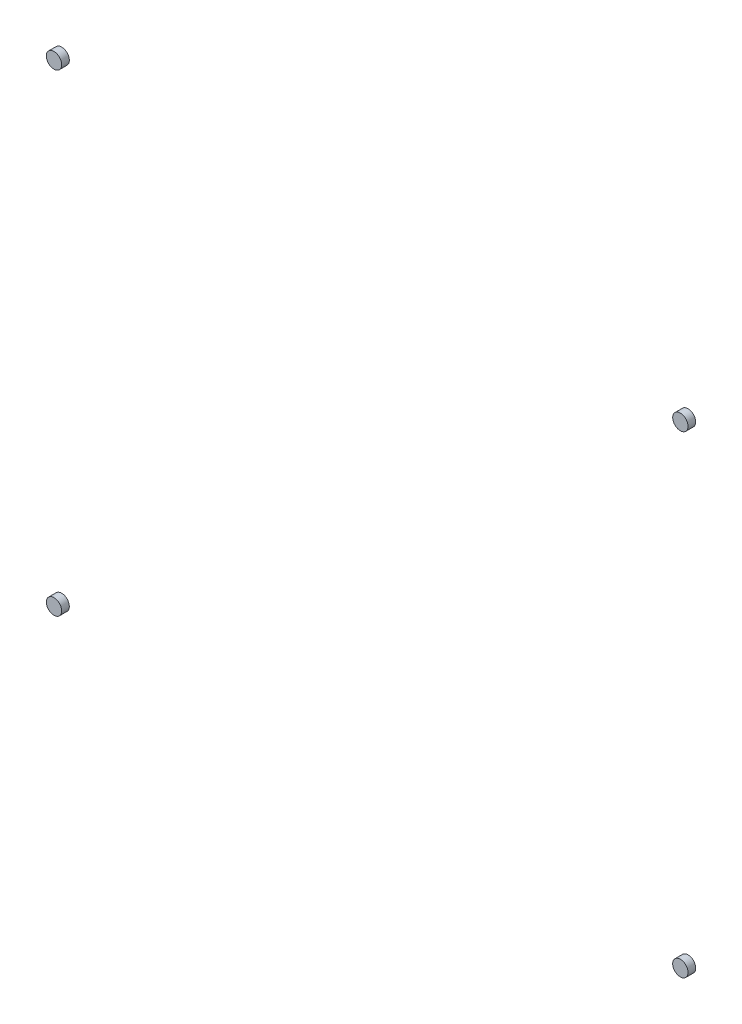
ISO-10303-21;
HEADER;
FILE_DESCRIPTION(('STEP AP214'),'2;1');
FILE_NAME('part.step','',(''),(''),'','','');
FILE_SCHEMA(('AUTOMOTIVE_DESIGN { 1 0 10303 214 1 1 1 1 }'));
ENDSEC;
DATA;
#1=APPLICATION_CONTEXT('core data for automotive mechanical design processes');
#2=APPLICATION_PROTOCOL_DEFINITION('international standard','automotive_design',2000,#1);
#3=PRODUCT_CONTEXT('',#1,'mechanical');
#4=PRODUCT('Part','Part','',(#3));
#5=PRODUCT_RELATED_PRODUCT_CATEGORY('part','',(#4));
#6=PRODUCT_DEFINITION_FORMATION('','',#4);
#7=PRODUCT_DEFINITION_CONTEXT('part definition',#1,'design');
#8=PRODUCT_DEFINITION('design','',#6,#7);
#9=PRODUCT_DEFINITION_SHAPE('','',#8);
#10=(LENGTH_UNIT() NAMED_UNIT(*) SI_UNIT(.MILLI.,.METRE.));
#11=(NAMED_UNIT(*) PLANE_ANGLE_UNIT() SI_UNIT($,.RADIAN.));
#12=(NAMED_UNIT(*) SI_UNIT($,.STERADIAN.) SOLID_ANGLE_UNIT());
#13=UNCERTAINTY_MEASURE_WITH_UNIT(LENGTH_MEASURE(1.E-05),#10,'distance_accuracy_value','');
#14=(GEOMETRIC_REPRESENTATION_CONTEXT(3) GLOBAL_UNCERTAINTY_ASSIGNED_CONTEXT((#13)) GLOBAL_UNIT_ASSIGNED_CONTEXT((#10,
#11,#12)) REPRESENTATION_CONTEXT('',''));
#15=CARTESIAN_POINT('',(0.,0.,0.));
#16=DIRECTION('',(0.,0.,1.));
#17=DIRECTION('',(1.,0.,0.));
#18=AXIS2_PLACEMENT_3D('',#15,#16,#17);
#19=CARTESIAN_POINT('',(-245.,-185.,6.));
#20=DIRECTION('',(0.,0.,1.));
#21=DIRECTION('',(1.,0.,0.));
#22=AXIS2_PLACEMENT_3D('',#19,#20,#21);
#23=PLANE('',#22);
#24=CARTESIAN_POINT('',(-245.,-185.,6.));
#25=DIRECTION('',(0.,0.,-1.));
#26=DIRECTION('',(-1.,0.,0.));
#27=AXIS2_PLACEMENT_3D('',#24,#25,#26);
#28=CIRCLE('',#27,6.);
#29=CARTESIAN_POINT('',(-251.,-185.,6.));
#30=VERTEX_POINT('',#29);
#31=EDGE_CURVE('P0_E10',#30,#30,#28,.T.);
#32=ORIENTED_EDGE('',*,*,#31,.F.);
#33=EDGE_LOOP('',(#32));
#34=FACE_BOUND('',#33,.T.);
#35=ADVANCED_FACE('P0_F15',(#34),#23,.T.);
#36=CARTESIAN_POINT('',(-245.,-185.,0.));
#37=DIRECTION('',(0.,0.,-1.));
#38=DIRECTION('',(-1.,0.,0.));
#39=AXIS2_PLACEMENT_3D('',#36,#37,#38);
#40=PLANE('',#39);
#41=CARTESIAN_POINT('',(-245.,-185.,0.));
#42=DIRECTION('',(0.,0.,1.));
#43=DIRECTION('',(1.,0.,0.));
#44=AXIS2_PLACEMENT_3D('',#41,#42,#43);
#45=CIRCLE('',#44,6.);
#46=CARTESIAN_POINT('',(-239.,-185.,0.));
#47=VERTEX_POINT('',#46);
#48=EDGE_CURVE('P0_E23',#47,#47,#45,.T.);
#49=ORIENTED_EDGE('',*,*,#48,.F.);
#50=EDGE_LOOP('',(#49));
#51=FACE_BOUND('',#50,.T.);
#52=ADVANCED_FACE('P0_F32',(#51),#40,.T.);
#53=CARTESIAN_POINT('',(-245.,-185.,0.));
#54=DIRECTION('',(0.,0.,1.));
#55=DIRECTION('',(1.,0.,0.));
#56=AXIS2_PLACEMENT_3D('',#53,#54,#55);
#57=CYLINDRICAL_SURFACE('',#56,6.);
#58=ORIENTED_EDGE('',*,*,#31,.T.);
#59=EDGE_LOOP('',(#58));
#60=FACE_BOUND('',#59,.T.);
#61=ORIENTED_EDGE('',*,*,#48,.T.);
#62=EDGE_LOOP('',(#61));
#63=FACE_BOUND('',#62,.T.);
#64=ADVANCED_FACE('P0_F17',(#60,#63),#57,.T.);
#65=CLOSED_SHELL('',(#35,#52,#64));
#66=MANIFOLD_SOLID_BREP('P0_B1',#65);
#67=CARTESIAN_POINT('',(-245.,185.,6.));
#68=DIRECTION('',(0.,0.,1.));
#69=DIRECTION('',(1.,0.,0.));
#70=AXIS2_PLACEMENT_3D('',#67,#68,#69);
#71=PLANE('',#70);
#72=CARTESIAN_POINT('',(-245.,185.,6.));
#73=DIRECTION('',(0.,0.,-1.));
#74=DIRECTION('',(-1.,0.,0.));
#75=AXIS2_PLACEMENT_3D('',#72,#73,#74);
#76=CIRCLE('',#75,6.);
#77=CARTESIAN_POINT('',(-251.,185.,6.));
#78=VERTEX_POINT('',#77);
#79=EDGE_CURVE('P1_E10',#78,#78,#76,.T.);
#80=ORIENTED_EDGE('',*,*,#79,.F.);
#81=EDGE_LOOP('',(#80));
#82=FACE_BOUND('',#81,.T.);
#83=ADVANCED_FACE('P1_F15',(#82),#71,.T.);
#84=CARTESIAN_POINT('',(-245.,185.,0.));
#85=DIRECTION('',(0.,0.,-1.));
#86=DIRECTION('',(-1.,0.,0.));
#87=AXIS2_PLACEMENT_3D('',#84,#85,#86);
#88=PLANE('',#87);
#89=CARTESIAN_POINT('',(-245.,185.,0.));
#90=DIRECTION('',(0.,0.,1.));
#91=DIRECTION('',(1.,0.,0.));
#92=AXIS2_PLACEMENT_3D('',#89,#90,#91);
#93=CIRCLE('',#92,6.);
#94=CARTESIAN_POINT('',(-239.,185.,0.));
#95=VERTEX_POINT('',#94);
#96=EDGE_CURVE('P1_E23',#95,#95,#93,.T.);
#97=ORIENTED_EDGE('',*,*,#96,.F.);
#98=EDGE_LOOP('',(#97));
#99=FACE_BOUND('',#98,.T.);
#100=ADVANCED_FACE('P1_F32',(#99),#88,.T.);
#101=CARTESIAN_POINT('',(-245.,185.,0.));
#102=DIRECTION('',(0.,0.,1.));
#103=DIRECTION('',(1.,0.,0.));
#104=AXIS2_PLACEMENT_3D('',#101,#102,#103);
#105=CYLINDRICAL_SURFACE('',#104,6.);
#106=ORIENTED_EDGE('',*,*,#79,.T.);
#107=EDGE_LOOP('',(#106));
#108=FACE_BOUND('',#107,.T.);
#109=ORIENTED_EDGE('',*,*,#96,.T.);
#110=EDGE_LOOP('',(#109));
#111=FACE_BOUND('',#110,.T.);
#112=ADVANCED_FACE('P1_F17',(#108,#111),#105,.T.);
#113=CLOSED_SHELL('',(#83,#100,#112));
#114=MANIFOLD_SOLID_BREP('P1_B1',#113);
#115=CARTESIAN_POINT('',(245.,-185.,6.));
#116=DIRECTION('',(0.,0.,1.));
#117=DIRECTION('',(1.,0.,0.));
#118=AXIS2_PLACEMENT_3D('',#115,#116,#117);
#119=PLANE('',#118);
#120=CARTESIAN_POINT('',(245.,-185.,6.));
#121=DIRECTION('',(0.,0.,-1.));
#122=DIRECTION('',(-1.,0.,0.));
#123=AXIS2_PLACEMENT_3D('',#120,#121,#122);
#124=CIRCLE('',#123,6.);
#125=CARTESIAN_POINT('',(239.,-185.,6.));
#126=VERTEX_POINT('',#125);
#127=EDGE_CURVE('P2_E10',#126,#126,#124,.T.);
#128=ORIENTED_EDGE('',*,*,#127,.F.);
#129=EDGE_LOOP('',(#128));
#130=FACE_BOUND('',#129,.T.);
#131=ADVANCED_FACE('P2_F15',(#130),#119,.T.);
#132=CARTESIAN_POINT('',(245.,-185.,0.));
#133=DIRECTION('',(0.,0.,-1.));
#134=DIRECTION('',(-1.,0.,0.));
#135=AXIS2_PLACEMENT_3D('',#132,#133,#134);
#136=PLANE('',#135);
#137=CARTESIAN_POINT('',(245.,-185.,0.));
#138=DIRECTION('',(0.,0.,1.));
#139=DIRECTION('',(1.,0.,0.));
#140=AXIS2_PLACEMENT_3D('',#137,#138,#139);
#141=CIRCLE('',#140,6.);
#142=CARTESIAN_POINT('',(251.,-185.,0.));
#143=VERTEX_POINT('',#142);
#144=EDGE_CURVE('P2_E23',#143,#143,#141,.T.);
#145=ORIENTED_EDGE('',*,*,#144,.F.);
#146=EDGE_LOOP('',(#145));
#147=FACE_BOUND('',#146,.T.);
#148=ADVANCED_FACE('P2_F32',(#147),#136,.T.);
#149=CARTESIAN_POINT('',(245.,-185.,0.));
#150=DIRECTION('',(0.,0.,1.));
#151=DIRECTION('',(1.,0.,0.));
#152=AXIS2_PLACEMENT_3D('',#149,#150,#151);
#153=CYLINDRICAL_SURFACE('',#152,6.);
#154=ORIENTED_EDGE('',*,*,#127,.T.);
#155=EDGE_LOOP('',(#154));
#156=FACE_BOUND('',#155,.T.);
#157=ORIENTED_EDGE('',*,*,#144,.T.);
#158=EDGE_LOOP('',(#157));
#159=FACE_BOUND('',#158,.T.);
#160=ADVANCED_FACE('P2_F17',(#156,#159),#153,.T.);
#161=CLOSED_SHELL('',(#131,#148,#160));
#162=MANIFOLD_SOLID_BREP('P2_B1',#161);
#163=CARTESIAN_POINT('',(245.,185.,6.));
#164=DIRECTION('',(0.,0.,1.));
#165=DIRECTION('',(1.,0.,0.));
#166=AXIS2_PLACEMENT_3D('',#163,#164,#165);
#167=PLANE('',#166);
#168=CARTESIAN_POINT('',(245.,185.,6.));
#169=DIRECTION('',(0.,0.,-1.));
#170=DIRECTION('',(-1.,0.,0.));
#171=AXIS2_PLACEMENT_3D('',#168,#169,#170);
#172=CIRCLE('',#171,6.);
#173=CARTESIAN_POINT('',(239.,185.,6.));
#174=VERTEX_POINT('',#173);
#175=EDGE_CURVE('P3_E10',#174,#174,#172,.T.);
#176=ORIENTED_EDGE('',*,*,#175,.F.);
#177=EDGE_LOOP('',(#176));
#178=FACE_BOUND('',#177,.T.);
#179=ADVANCED_FACE('P3_F15',(#178),#167,.T.);
#180=CARTESIAN_POINT('',(245.,185.,0.));
#181=DIRECTION('',(0.,0.,-1.));
#182=DIRECTION('',(-1.,0.,0.));
#183=AXIS2_PLACEMENT_3D('',#180,#181,#182);
#184=PLANE('',#183);
#185=CARTESIAN_POINT('',(245.,185.,0.));
#186=DIRECTION('',(0.,0.,1.));
#187=DIRECTION('',(1.,0.,0.));
#188=AXIS2_PLACEMENT_3D('',#185,#186,#187);
#189=CIRCLE('',#188,6.);
#190=CARTESIAN_POINT('',(251.,185.,0.));
#191=VERTEX_POINT('',#190);
#192=EDGE_CURVE('P3_E23',#191,#191,#189,.T.);
#193=ORIENTED_EDGE('',*,*,#192,.F.);
#194=EDGE_LOOP('',(#193));
#195=FACE_BOUND('',#194,.T.);
#196=ADVANCED_FACE('P3_F32',(#195),#184,.T.);
#197=CARTESIAN_POINT('',(245.,185.,0.));
#198=DIRECTION('',(0.,0.,1.));
#199=DIRECTION('',(1.,0.,0.));
#200=AXIS2_PLACEMENT_3D('',#197,#198,#199);
#201=CYLINDRICAL_SURFACE('',#200,6.);
#202=ORIENTED_EDGE('',*,*,#175,.T.);
#203=EDGE_LOOP('',(#202));
#204=FACE_BOUND('',#203,.T.);
#205=ORIENTED_EDGE('',*,*,#192,.T.);
#206=EDGE_LOOP('',(#205));
#207=FACE_BOUND('',#206,.T.);
#208=ADVANCED_FACE('P3_F17',(#204,#207),#201,.T.);
#209=CLOSED_SHELL('',(#179,#196,#208));
#210=MANIFOLD_SOLID_BREP('P3_B1',#209);
#211=ADVANCED_BREP_SHAPE_REPRESENTATION('',(#18,#66,#114,#162,#210),#14);
#212=SHAPE_DEFINITION_REPRESENTATION(#9,#211);
ENDSEC;
END-ISO-10303-21;
